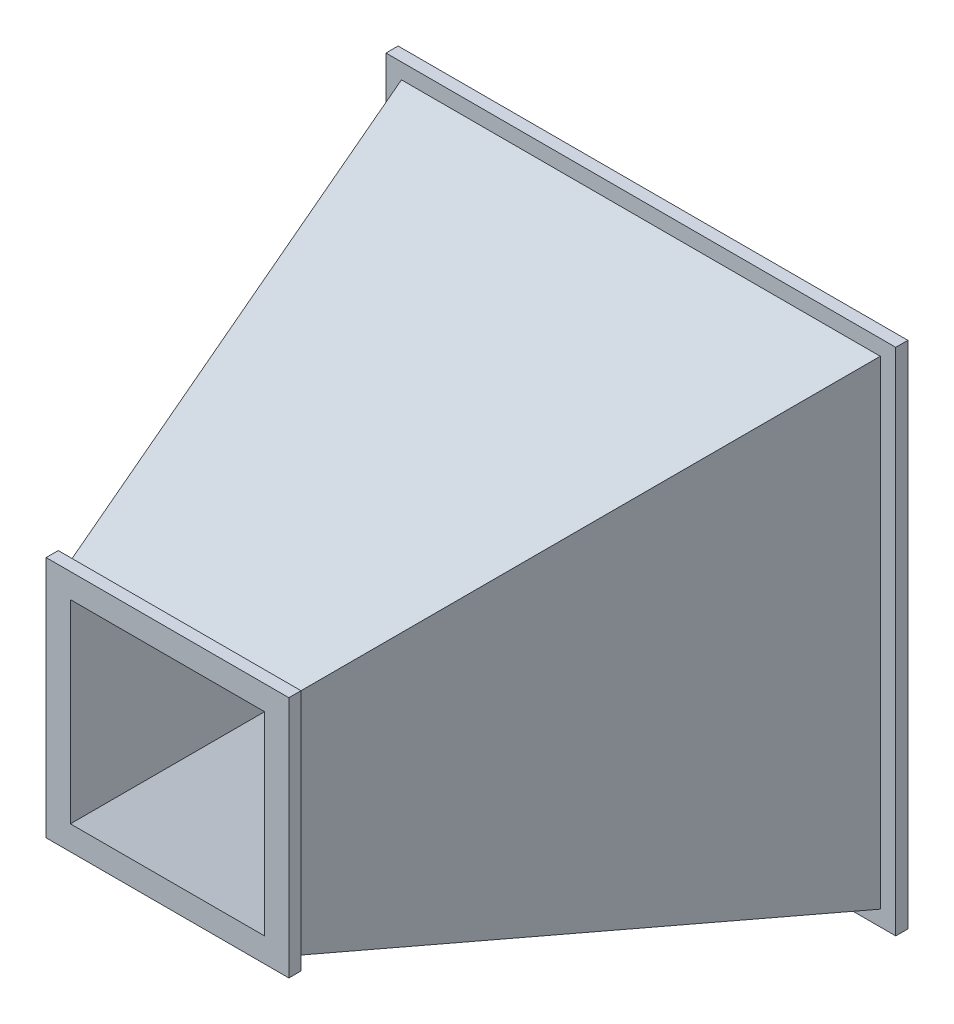
ISO-10303-21;
HEADER;
FILE_DESCRIPTION(('STEP AP214'),'2;1');
FILE_NAME('part.step','',(''),(''),'','','');
FILE_SCHEMA(('AUTOMOTIVE_DESIGN { 1 0 10303 214 1 1 1 1 }'));
ENDSEC;
DATA;
#1=APPLICATION_CONTEXT('core data for automotive mechanical design processes');
#2=APPLICATION_PROTOCOL_DEFINITION('international standard','automotive_design',2000,#1);
#3=PRODUCT_CONTEXT('',#1,'mechanical');
#4=PRODUCT('Part','Part','',(#3));
#5=PRODUCT_RELATED_PRODUCT_CATEGORY('part','',(#4));
#6=PRODUCT_DEFINITION_FORMATION('','',#4);
#7=PRODUCT_DEFINITION_CONTEXT('part definition',#1,'design');
#8=PRODUCT_DEFINITION('design','',#6,#7);
#9=PRODUCT_DEFINITION_SHAPE('','',#8);
#10=(LENGTH_UNIT() NAMED_UNIT(*) SI_UNIT(.MILLI.,.METRE.));
#11=(NAMED_UNIT(*) PLANE_ANGLE_UNIT() SI_UNIT($,.RADIAN.));
#12=(NAMED_UNIT(*) SI_UNIT($,.STERADIAN.) SOLID_ANGLE_UNIT());
#13=UNCERTAINTY_MEASURE_WITH_UNIT(LENGTH_MEASURE(1.E-05),#10,'distance_accuracy_value','');
#14=(GEOMETRIC_REPRESENTATION_CONTEXT(3) GLOBAL_UNCERTAINTY_ASSIGNED_CONTEXT((#13)) GLOBAL_UNIT_ASSIGNED_CONTEXT((#10,
#11,#12)) REPRESENTATION_CONTEXT('',''));
#15=CARTESIAN_POINT('',(0.,0.,0.));
#16=DIRECTION('',(0.,0.,1.));
#17=DIRECTION('',(1.,0.,0.));
#18=AXIS2_PLACEMENT_3D('',#15,#16,#17);
#19=CARTESIAN_POINT('',(0.,0.,0.));
#20=DIRECTION('',(0.,0.,1.));
#21=DIRECTION('',(1.,0.,0.));
#22=AXIS2_PLACEMENT_3D('',#19,#20,#21);
#23=PLANE('',#22);
#24=DIRECTION('',(1.,0.,0.));
#25=VECTOR('',#24,1.);
#26=CARTESIAN_POINT('',(-105.,105.,0.));
#27=LINE('',#26,#25);
#28=CARTESIAN_POINT('',(-105.,105.,0.));
#29=VERTEX_POINT('',#28);
#30=CARTESIAN_POINT('',(105.,105.,0.));
#31=VERTEX_POINT('',#30);
#32=EDGE_CURVE('E274',#29,#31,#27,.T.);
#33=ORIENTED_EDGE('',*,*,#32,.T.);
#34=DIRECTION('',(0.,-1.,0.));
#35=VECTOR('',#34,1.);
#36=CARTESIAN_POINT('',(105.,105.,0.));
#37=LINE('',#36,#35);
#38=CARTESIAN_POINT('',(105.,-105.,0.));
#39=VERTEX_POINT('',#38);
#40=EDGE_CURVE('E291',#31,#39,#37,.T.);
#41=ORIENTED_EDGE('',*,*,#40,.T.);
#42=DIRECTION('',(-1.,0.,0.));
#43=VECTOR('',#42,1.);
#44=CARTESIAN_POINT('',(105.,-105.,0.));
#45=LINE('',#44,#43);
#46=CARTESIAN_POINT('',(-105.,-105.,0.));
#47=VERTEX_POINT('',#46);
#48=EDGE_CURVE('E294',#39,#47,#45,.T.);
#49=ORIENTED_EDGE('',*,*,#48,.T.);
#50=DIRECTION('',(0.,1.,0.));
#51=VECTOR('',#50,1.);
#52=CARTESIAN_POINT('',(-105.,-105.,0.));
#53=LINE('',#52,#51);
#54=EDGE_CURVE('E279',#47,#29,#53,.T.);
#55=ORIENTED_EDGE('',*,*,#54,.T.);
#56=EDGE_LOOP('',(#33,#41,#49,#55));
#57=FACE_BOUND('',#56,.T.);
#58=DIRECTION('',(0.,-1.,0.));
#59=VECTOR('',#58,1.);
#60=CARTESIAN_POINT('',(95.,95.,0.));
#61=LINE('',#60,#59);
#62=CARTESIAN_POINT('',(95.,95.,0.));
#63=VERTEX_POINT('',#62);
#64=CARTESIAN_POINT('',(95.,-95.,0.));
#65=VERTEX_POINT('',#64);
#66=EDGE_CURVE('E208',#63,#65,#61,.T.);
#67=ORIENTED_EDGE('',*,*,#66,.F.);
#68=DIRECTION('',(1.,0.,0.));
#69=VECTOR('',#68,1.);
#70=CARTESIAN_POINT('',(-95.,95.,0.));
#71=LINE('',#70,#69);
#72=CARTESIAN_POINT('',(-95.,95.,0.));
#73=VERTEX_POINT('',#72);
#74=EDGE_CURVE('E211',#73,#63,#71,.T.);
#75=ORIENTED_EDGE('',*,*,#74,.F.);
#76=DIRECTION('',(0.,1.,0.));
#77=VECTOR('',#76,1.);
#78=CARTESIAN_POINT('',(-95.,-95.,0.));
#79=LINE('',#78,#77);
#80=CARTESIAN_POINT('',(-95.,-95.,0.));
#81=VERTEX_POINT('',#80);
#82=EDGE_CURVE('E202',#81,#73,#79,.T.);
#83=ORIENTED_EDGE('',*,*,#82,.F.);
#84=DIRECTION('',(-1.,0.,0.));
#85=VECTOR('',#84,1.);
#86=CARTESIAN_POINT('',(95.,-95.,0.));
#87=LINE('',#86,#85);
#88=EDGE_CURVE('E73',#65,#81,#87,.T.);
#89=ORIENTED_EDGE('',*,*,#88,.F.);
#90=EDGE_LOOP('',(#67,#75,#83,#89));
#91=FACE_BOUND('',#90,.T.);
#92=ADVANCED_FACE('F57',(#57,#91),#23,.F.);
#93=CARTESIAN_POINT('',(0.,0.,200.));
#94=DIRECTION('',(0.,0.,1.));
#95=DIRECTION('',(1.,0.,0.));
#96=AXIS2_PLACEMENT_3D('',#93,#94,#95);
#97=PLANE('',#96);
#98=DIRECTION('',(0.,1.,0.));
#99=VECTOR('',#98,1.);
#100=CARTESIAN_POINT('',(50.,-50.,200.));
#101=LINE('',#100,#99);
#102=CARTESIAN_POINT('',(50.,-50.,200.));
#103=VERTEX_POINT('',#102);
#104=CARTESIAN_POINT('',(50.,50.,200.));
#105=VERTEX_POINT('',#104);
#106=EDGE_CURVE('E204',#103,#105,#101,.T.);
#107=ORIENTED_EDGE('',*,*,#106,.T.);
#108=DIRECTION('',(-1.,0.,0.));
#109=VECTOR('',#108,1.);
#110=CARTESIAN_POINT('',(50.,50.,200.));
#111=LINE('',#110,#109);
#112=CARTESIAN_POINT('',(-50.,50.,200.));
#113=VERTEX_POINT('',#112);
#114=EDGE_CURVE('E250',#105,#113,#111,.T.);
#115=ORIENTED_EDGE('',*,*,#114,.T.);
#116=DIRECTION('',(0.,-1.,0.));
#117=VECTOR('',#116,1.);
#118=CARTESIAN_POINT('',(-50.,50.,200.));
#119=LINE('',#118,#117);
#120=CARTESIAN_POINT('',(-50.,-50.,200.));
#121=VERTEX_POINT('',#120);
#122=EDGE_CURVE('E253',#113,#121,#119,.T.);
#123=ORIENTED_EDGE('',*,*,#122,.T.);
#124=DIRECTION('',(1.,0.,0.));
#125=VECTOR('',#124,1.);
#126=CARTESIAN_POINT('',(-50.,-50.,200.));
#127=LINE('',#126,#125);
#128=EDGE_CURVE('E238',#121,#103,#127,.T.);
#129=ORIENTED_EDGE('',*,*,#128,.T.);
#130=EDGE_LOOP('',(#107,#115,#123,#129));
#131=FACE_BOUND('',#130,.T.);
#132=DIRECTION('',(-1.,0.,0.));
#133=VECTOR('',#132,1.);
#134=CARTESIAN_POINT('',(40.,40.,200.));
#135=LINE('',#134,#133);
#136=CARTESIAN_POINT('',(40.,40.,200.));
#137=VERTEX_POINT('',#136);
#138=CARTESIAN_POINT('',(-40.,40.,200.));
#139=VERTEX_POINT('',#138);
#140=EDGE_CURVE('E81',#137,#139,#135,.T.);
#141=ORIENTED_EDGE('',*,*,#140,.F.);
#142=DIRECTION('',(0.,1.,0.));
#143=VECTOR('',#142,1.);
#144=CARTESIAN_POINT('',(40.,-40.,200.));
#145=LINE('',#144,#143);
#146=CARTESIAN_POINT('',(40.,-40.,200.));
#147=VERTEX_POINT('',#146);
#148=EDGE_CURVE('E189',#147,#137,#145,.T.);
#149=ORIENTED_EDGE('',*,*,#148,.F.);
#150=DIRECTION('',(1.,0.,0.));
#151=VECTOR('',#150,1.);
#152=CARTESIAN_POINT('',(-40.,-40.,200.));
#153=LINE('',#152,#151);
#154=CARTESIAN_POINT('',(-40.,-40.,200.));
#155=VERTEX_POINT('',#154);
#156=EDGE_CURVE('E183',#155,#147,#153,.T.);
#157=ORIENTED_EDGE('',*,*,#156,.F.);
#158=DIRECTION('',(0.,-1.,0.));
#159=VECTOR('',#158,1.);
#160=CARTESIAN_POINT('',(-40.,40.,200.));
#161=LINE('',#160,#159);
#162=EDGE_CURVE('E172',#139,#155,#161,.T.);
#163=ORIENTED_EDGE('',*,*,#162,.F.);
#164=EDGE_LOOP('',(#141,#149,#157,#163));
#165=FACE_BOUND('',#164,.T.);
#166=ADVANCED_FACE('F187',(#131,#165),#97,.T.);
#167=CARTESIAN_POINT('',(0.,92.9692039511912,25.5665310865776));
#168=DIRECTION('',(0.,0.96420539280379,0.265156483021042));
#169=DIRECTION('',(0.,-0.265156483021042,0.96420539280379));
#170=AXIS2_PLACEMENT_3D('',#167,#168,#169);
#171=PLANE('',#170);
#172=DIRECTION('',(-0.256299566854098,0.256299566854098,-0.931998424923993));
#173=VECTOR('',#172,1.);
#174=CARTESIAN_POINT('',(-45.,45.,200.));
#175=LINE('',#174,#173);
#176=CARTESIAN_POINT('',(-46.375,46.375,195.));
#177=VERTEX_POINT('',#176);
#178=CARTESIAN_POINT('',(-98.625,98.625,4.99999999999999));
#179=VERTEX_POINT('',#178);
#180=EDGE_CURVE('E322',#177,#179,#175,.T.);
#181=ORIENTED_EDGE('',*,*,#180,.F.);
#182=DIRECTION('',(1.,0.,0.));
#183=VECTOR('',#182,1.);
#184=CARTESIAN_POINT('',(0.,46.375,195.));
#185=LINE('',#184,#183);
#186=CARTESIAN_POINT('',(46.375,46.375,195.));
#187=VERTEX_POINT('',#186);
#188=EDGE_CURVE('E271',#177,#187,#185,.T.);
#189=ORIENTED_EDGE('',*,*,#188,.T.);
#190=DIRECTION('',(0.256299566854098,0.256299566854098,-0.931998424923993));
#191=VECTOR('',#190,1.);
#192=CARTESIAN_POINT('',(45.,45.,200.));
#193=LINE('',#192,#191);
#194=CARTESIAN_POINT('',(98.625,98.625,4.99999999999999));
#195=VERTEX_POINT('',#194);
#196=EDGE_CURVE('E315',#187,#195,#193,.T.);
#197=ORIENTED_EDGE('',*,*,#196,.T.);
#198=DIRECTION('',(-1.,0.,0.));
#199=VECTOR('',#198,1.);
#200=CARTESIAN_POINT('',(0.,98.625,5.));
#201=LINE('',#200,#199);
#202=EDGE_CURVE('E312',#195,#179,#201,.T.);
#203=ORIENTED_EDGE('',*,*,#202,.T.);
#204=EDGE_LOOP('',(#181,#189,#197,#203));
#205=FACE_BOUND('',#204,.T.);
#206=ADVANCED_FACE('F349',(#205),#171,.T.);
#207=CARTESIAN_POINT('',(-92.9692039511911,0.,25.5665310865776));
#208=DIRECTION('',(-0.96420539280379,0.,0.265156483021042));
#209=DIRECTION('',(0.265156483021042,0.,0.96420539280379));
#210=AXIS2_PLACEMENT_3D('',#207,#208,#209);
#211=PLANE('',#210);
#212=DIRECTION('',(-0.256299566854098,-0.256299566854098,-0.931998424923993));
#213=VECTOR('',#212,1.);
#214=CARTESIAN_POINT('',(-45.,-45.,200.));
#215=LINE('',#214,#213);
#216=CARTESIAN_POINT('',(-46.375,-46.375,195.));
#217=VERTEX_POINT('',#216);
#218=CARTESIAN_POINT('',(-98.625,-98.625,5.));
#219=VERTEX_POINT('',#218);
#220=EDGE_CURVE('E328',#217,#219,#215,.T.);
#221=ORIENTED_EDGE('',*,*,#220,.F.);
#222=DIRECTION('',(0.,1.,0.));
#223=VECTOR('',#222,1.);
#224=CARTESIAN_POINT('',(-46.375,0.,195.));
#225=LINE('',#224,#223);
#226=EDGE_CURVE('E268',#217,#177,#225,.T.);
#227=ORIENTED_EDGE('',*,*,#226,.T.);
#228=ORIENTED_EDGE('',*,*,#180,.T.);
#229=DIRECTION('',(0.,-1.,0.));
#230=VECTOR('',#229,1.);
#231=CARTESIAN_POINT('',(-98.625,0.,5.));
#232=LINE('',#231,#230);
#233=EDGE_CURVE('E309',#179,#219,#232,.T.);
#234=ORIENTED_EDGE('',*,*,#233,.T.);
#235=EDGE_LOOP('',(#221,#227,#228,#234));
#236=FACE_BOUND('',#235,.T.);
#237=ADVANCED_FACE('F346',(#236),#211,.T.);
#238=CARTESIAN_POINT('',(92.9692039511912,0.,25.5665310865776));
#239=DIRECTION('',(0.96420539280379,0.,0.265156483021042));
#240=DIRECTION('',(0.265156483021042,0.,-0.96420539280379));
#241=AXIS2_PLACEMENT_3D('',#238,#239,#240);
#242=PLANE('',#241);
#243=ORIENTED_EDGE('',*,*,#196,.F.);
#244=DIRECTION('',(0.,-1.,0.));
#245=VECTOR('',#244,1.);
#246=CARTESIAN_POINT('',(46.375,0.,195.));
#247=LINE('',#246,#245);
#248=CARTESIAN_POINT('',(46.375,-46.375,195.));
#249=VERTEX_POINT('',#248);
#250=EDGE_CURVE('E260',#187,#249,#247,.T.);
#251=ORIENTED_EDGE('',*,*,#250,.T.);
#252=DIRECTION('',(0.256299566854098,-0.256299566854098,-0.931998424923993));
#253=VECTOR('',#252,1.);
#254=CARTESIAN_POINT('',(45.,-45.,200.));
#255=LINE('',#254,#253);
#256=CARTESIAN_POINT('',(98.625,-98.625,4.99999999999999));
#257=VERTEX_POINT('',#256);
#258=EDGE_CURVE('E324',#249,#257,#255,.T.);
#259=ORIENTED_EDGE('',*,*,#258,.T.);
#260=DIRECTION('',(0.,1.,0.));
#261=VECTOR('',#260,1.);
#262=CARTESIAN_POINT('',(98.625,0.,5.));
#263=LINE('',#262,#261);
#264=EDGE_CURVE('E301',#257,#195,#263,.T.);
#265=ORIENTED_EDGE('',*,*,#264,.T.);
#266=EDGE_LOOP('',(#243,#251,#259,#265));
#267=FACE_BOUND('',#266,.T.);
#268=ADVANCED_FACE('F351',(#267),#242,.T.);
#269=CARTESIAN_POINT('',(0.,-92.9692039511912,25.5665310865776));
#270=DIRECTION('',(0.,-0.96420539280379,0.265156483021042));
#271=DIRECTION('',(0.,-0.265156483021042,-0.96420539280379));
#272=AXIS2_PLACEMENT_3D('',#269,#270,#271);
#273=PLANE('',#272);
#274=ORIENTED_EDGE('',*,*,#258,.F.);
#275=DIRECTION('',(-1.,0.,0.));
#276=VECTOR('',#275,1.);
#277=CARTESIAN_POINT('',(0.,-46.375,195.));
#278=LINE('',#277,#276);
#279=EDGE_CURVE('E12',#249,#217,#278,.T.);
#280=ORIENTED_EDGE('',*,*,#279,.T.);
#281=ORIENTED_EDGE('',*,*,#220,.T.);
#282=DIRECTION('',(1.,0.,0.));
#283=VECTOR('',#282,1.);
#284=CARTESIAN_POINT('',(0.,-98.625,5.));
#285=LINE('',#284,#283);
#286=EDGE_CURVE('E65',#219,#257,#285,.T.);
#287=ORIENTED_EDGE('',*,*,#286,.T.);
#288=EDGE_LOOP('',(#274,#280,#281,#287));
#289=FACE_BOUND('',#288,.T.);
#290=ADVANCED_FACE('F340',(#289),#273,.T.);
#291=CARTESIAN_POINT('',(-105.,105.,5.));
#292=DIRECTION('',(0.,1.,0.));
#293=DIRECTION('',(0.,0.,1.));
#294=AXIS2_PLACEMENT_3D('',#291,#292,#293);
#295=PLANE('',#294);
#296=ORIENTED_EDGE('',*,*,#32,.F.);
#297=DIRECTION('',(0.,0.,-1.));
#298=VECTOR('',#297,1.);
#299=CARTESIAN_POINT('',(-105.,105.,5.));
#300=LINE('',#299,#298);
#301=CARTESIAN_POINT('',(-105.,105.,5.));
#302=VERTEX_POINT('',#301);
#303=EDGE_CURVE('E299',#302,#29,#300,.T.);
#304=ORIENTED_EDGE('',*,*,#303,.F.);
#305=DIRECTION('',(1.,0.,0.));
#306=VECTOR('',#305,1.);
#307=CARTESIAN_POINT('',(-105.,105.,5.));
#308=LINE('',#307,#306);
#309=CARTESIAN_POINT('',(105.,105.,5.));
#310=VERTEX_POINT('',#309);
#311=EDGE_CURVE('E275',#302,#310,#308,.T.);
#312=ORIENTED_EDGE('',*,*,#311,.T.);
#313=DIRECTION('',(0.,0.,-1.));
#314=VECTOR('',#313,1.);
#315=CARTESIAN_POINT('',(105.,105.,5.));
#316=LINE('',#315,#314);
#317=EDGE_CURVE('E288',#310,#31,#316,.T.);
#318=ORIENTED_EDGE('',*,*,#317,.T.);
#319=EDGE_LOOP('',(#296,#304,#312,#318));
#320=FACE_BOUND('',#319,.T.);
#321=ADVANCED_FACE('F383',(#320),#295,.T.);
#322=CARTESIAN_POINT('',(-105.,-105.,5.));
#323=DIRECTION('',(-1.,0.,0.));
#324=DIRECTION('',(0.,-1.,0.));
#325=AXIS2_PLACEMENT_3D('',#322,#323,#324);
#326=PLANE('',#325);
#327=ORIENTED_EDGE('',*,*,#54,.F.);
#328=DIRECTION('',(0.,0.,-1.));
#329=VECTOR('',#328,1.);
#330=CARTESIAN_POINT('',(-105.,-105.,5.));
#331=LINE('',#330,#329);
#332=CARTESIAN_POINT('',(-105.,-105.,5.));
#333=VERTEX_POINT('',#332);
#334=EDGE_CURVE('E302',#333,#47,#331,.T.);
#335=ORIENTED_EDGE('',*,*,#334,.F.);
#336=DIRECTION('',(0.,1.,0.));
#337=VECTOR('',#336,1.);
#338=CARTESIAN_POINT('',(-105.,-105.,5.));
#339=LINE('',#338,#337);
#340=EDGE_CURVE('E285',#333,#302,#339,.T.);
#341=ORIENTED_EDGE('',*,*,#340,.T.);
#342=ORIENTED_EDGE('',*,*,#303,.T.);
#343=EDGE_LOOP('',(#327,#335,#341,#342));
#344=FACE_BOUND('',#343,.T.);
#345=ADVANCED_FACE('F394',(#344),#326,.T.);
#346=CARTESIAN_POINT('',(105.,-105.,5.));
#347=DIRECTION('',(0.,-1.,0.));
#348=DIRECTION('',(0.,0.,-1.));
#349=AXIS2_PLACEMENT_3D('',#346,#347,#348);
#350=PLANE('',#349);
#351=ORIENTED_EDGE('',*,*,#48,.F.);
#352=DIRECTION('',(0.,0.,-1.));
#353=VECTOR('',#352,1.);
#354=CARTESIAN_POINT('',(105.,-105.,5.));
#355=LINE('',#354,#353);
#356=CARTESIAN_POINT('',(105.,-105.,5.));
#357=VERTEX_POINT('',#356);
#358=EDGE_CURVE('E304',#357,#39,#355,.T.);
#359=ORIENTED_EDGE('',*,*,#358,.F.);
#360=DIRECTION('',(-1.,0.,0.));
#361=VECTOR('',#360,1.);
#362=CARTESIAN_POINT('',(105.,-105.,5.));
#363=LINE('',#362,#361);
#364=EDGE_CURVE('E282',#357,#333,#363,.T.);
#365=ORIENTED_EDGE('',*,*,#364,.T.);
#366=ORIENTED_EDGE('',*,*,#334,.T.);
#367=EDGE_LOOP('',(#351,#359,#365,#366));
#368=FACE_BOUND('',#367,.T.);
#369=ADVANCED_FACE('F399',(#368),#350,.T.);
#370=CARTESIAN_POINT('',(105.,105.,5.));
#371=DIRECTION('',(1.,0.,0.));
#372=DIRECTION('',(0.,1.,0.));
#373=AXIS2_PLACEMENT_3D('',#370,#371,#372);
#374=PLANE('',#373);
#375=ORIENTED_EDGE('',*,*,#40,.F.);
#376=ORIENTED_EDGE('',*,*,#317,.F.);
#377=DIRECTION('',(0.,-1.,0.));
#378=VECTOR('',#377,1.);
#379=CARTESIAN_POINT('',(105.,105.,5.));
#380=LINE('',#379,#378);
#381=EDGE_CURVE('E278',#310,#357,#380,.T.);
#382=ORIENTED_EDGE('',*,*,#381,.T.);
#383=ORIENTED_EDGE('',*,*,#358,.T.);
#384=EDGE_LOOP('',(#375,#376,#382,#383));
#385=FACE_BOUND('',#384,.T.);
#386=ADVANCED_FACE('F411',(#385),#374,.T.);
#387=CARTESIAN_POINT('',(0.,0.,5.));
#388=DIRECTION('',(0.,0.,-1.));
#389=DIRECTION('',(-1.,0.,0.));
#390=AXIS2_PLACEMENT_3D('',#387,#388,#389);
#391=PLANE('',#390);
#392=ORIENTED_EDGE('',*,*,#202,.F.);
#393=ORIENTED_EDGE('',*,*,#264,.F.);
#394=ORIENTED_EDGE('',*,*,#286,.F.);
#395=ORIENTED_EDGE('',*,*,#233,.F.);
#396=EDGE_LOOP('',(#392,#393,#394,#395));
#397=FACE_BOUND('',#396,.T.);
#398=ORIENTED_EDGE('',*,*,#311,.F.);
#399=ORIENTED_EDGE('',*,*,#340,.F.);
#400=ORIENTED_EDGE('',*,*,#364,.F.);
#401=ORIENTED_EDGE('',*,*,#381,.F.);
#402=EDGE_LOOP('',(#398,#399,#400,#401));
#403=FACE_BOUND('',#402,.T.);
#404=ADVANCED_FACE('F344',(#397,#403),#391,.F.);
#405=CARTESIAN_POINT('',(50.,-50.,195.));
#406=DIRECTION('',(1.,0.,0.));
#407=DIRECTION('',(0.,1.,0.));
#408=AXIS2_PLACEMENT_3D('',#405,#406,#407);
#409=PLANE('',#408);
#410=ORIENTED_EDGE('',*,*,#106,.F.);
#411=DIRECTION('',(0.,0.,1.));
#412=VECTOR('',#411,1.);
#413=CARTESIAN_POINT('',(50.,-50.,195.));
#414=LINE('',#413,#412);
#415=CARTESIAN_POINT('',(50.,-50.,195.));
#416=VERTEX_POINT('',#415);
#417=EDGE_CURVE('E258',#416,#103,#414,.T.);
#418=ORIENTED_EDGE('',*,*,#417,.F.);
#419=DIRECTION('',(0.,1.,0.));
#420=VECTOR('',#419,1.);
#421=CARTESIAN_POINT('',(50.,-50.,195.));
#422=LINE('',#421,#420);
#423=CARTESIAN_POINT('',(50.,50.,195.));
#424=VERTEX_POINT('',#423);
#425=EDGE_CURVE('E234',#416,#424,#422,.T.);
#426=ORIENTED_EDGE('',*,*,#425,.T.);
#427=DIRECTION('',(0.,0.,1.));
#428=VECTOR('',#427,1.);
#429=CARTESIAN_POINT('',(50.,50.,195.));
#430=LINE('',#429,#428);
#431=EDGE_CURVE('E247',#424,#105,#430,.T.);
#432=ORIENTED_EDGE('',*,*,#431,.T.);
#433=EDGE_LOOP('',(#410,#418,#426,#432));
#434=FACE_BOUND('',#433,.T.);
#435=ADVANCED_FACE('F371',(#434),#409,.T.);
#436=CARTESIAN_POINT('',(-50.,-50.,195.));
#437=DIRECTION('',(0.,-1.,0.));
#438=DIRECTION('',(0.,0.,-1.));
#439=AXIS2_PLACEMENT_3D('',#436,#437,#438);
#440=PLANE('',#439);
#441=ORIENTED_EDGE('',*,*,#128,.F.);
#442=DIRECTION('',(0.,0.,1.));
#443=VECTOR('',#442,1.);
#444=CARTESIAN_POINT('',(-50.,-50.,195.));
#445=LINE('',#444,#443);
#446=CARTESIAN_POINT('',(-50.,-50.,195.));
#447=VERTEX_POINT('',#446);
#448=EDGE_CURVE('E261',#447,#121,#445,.T.);
#449=ORIENTED_EDGE('',*,*,#448,.F.);
#450=DIRECTION('',(1.,0.,0.));
#451=VECTOR('',#450,1.);
#452=CARTESIAN_POINT('',(-50.,-50.,195.));
#453=LINE('',#452,#451);
#454=EDGE_CURVE('E244',#447,#416,#453,.T.);
#455=ORIENTED_EDGE('',*,*,#454,.T.);
#456=ORIENTED_EDGE('',*,*,#417,.T.);
#457=EDGE_LOOP('',(#441,#449,#455,#456));
#458=FACE_BOUND('',#457,.T.);
#459=ADVANCED_FACE('F364',(#458),#440,.T.);
#460=CARTESIAN_POINT('',(-50.,50.,195.));
#461=DIRECTION('',(-1.,0.,0.));
#462=DIRECTION('',(0.,-1.,0.));
#463=AXIS2_PLACEMENT_3D('',#460,#461,#462);
#464=PLANE('',#463);
#465=ORIENTED_EDGE('',*,*,#122,.F.);
#466=DIRECTION('',(0.,0.,1.));
#467=VECTOR('',#466,1.);
#468=CARTESIAN_POINT('',(-50.,50.,195.));
#469=LINE('',#468,#467);
#470=CARTESIAN_POINT('',(-50.,50.,195.));
#471=VERTEX_POINT('',#470);
#472=EDGE_CURVE('E263',#471,#113,#469,.T.);
#473=ORIENTED_EDGE('',*,*,#472,.F.);
#474=DIRECTION('',(0.,-1.,0.));
#475=VECTOR('',#474,1.);
#476=CARTESIAN_POINT('',(-50.,50.,195.));
#477=LINE('',#476,#475);
#478=EDGE_CURVE('E241',#471,#447,#477,.T.);
#479=ORIENTED_EDGE('',*,*,#478,.T.);
#480=ORIENTED_EDGE('',*,*,#448,.T.);
#481=EDGE_LOOP('',(#465,#473,#479,#480));
#482=FACE_BOUND('',#481,.T.);
#483=ADVANCED_FACE('F368',(#482),#464,.T.);
#484=CARTESIAN_POINT('',(50.,50.,195.));
#485=DIRECTION('',(0.,1.,0.));
#486=DIRECTION('',(0.,0.,1.));
#487=AXIS2_PLACEMENT_3D('',#484,#485,#486);
#488=PLANE('',#487);
#489=ORIENTED_EDGE('',*,*,#114,.F.);
#490=ORIENTED_EDGE('',*,*,#431,.F.);
#491=DIRECTION('',(-1.,0.,0.));
#492=VECTOR('',#491,1.);
#493=CARTESIAN_POINT('',(50.,50.,195.));
#494=LINE('',#493,#492);
#495=EDGE_CURVE('E237',#424,#471,#494,.T.);
#496=ORIENTED_EDGE('',*,*,#495,.T.);
#497=ORIENTED_EDGE('',*,*,#472,.T.);
#498=EDGE_LOOP('',(#489,#490,#496,#497));
#499=FACE_BOUND('',#498,.T.);
#500=ADVANCED_FACE('F355',(#499),#488,.T.);
#501=CARTESIAN_POINT('',(0.,0.,195.));
#502=DIRECTION('',(0.,0.,1.));
#503=DIRECTION('',(1.,0.,0.));
#504=AXIS2_PLACEMENT_3D('',#501,#502,#503);
#505=PLANE('',#504);
#506=ORIENTED_EDGE('',*,*,#188,.F.);
#507=ORIENTED_EDGE('',*,*,#226,.F.);
#508=ORIENTED_EDGE('',*,*,#279,.F.);
#509=ORIENTED_EDGE('',*,*,#250,.F.);
#510=EDGE_LOOP('',(#506,#507,#508,#509));
#511=FACE_BOUND('',#510,.T.);
#512=ORIENTED_EDGE('',*,*,#425,.F.);
#513=ORIENTED_EDGE('',*,*,#454,.F.);
#514=ORIENTED_EDGE('',*,*,#478,.F.);
#515=ORIENTED_EDGE('',*,*,#495,.F.);
#516=EDGE_LOOP('',(#512,#513,#514,#515));
#517=FACE_BOUND('',#516,.T.);
#518=ADVANCED_FACE('F352',(#511,#517),#505,.F.);
#519=CARTESIAN_POINT('',(88.3207437536316,0.,24.2882045322487));
#520=DIRECTION('',(-0.96420539280379,0.,-0.265156483021042));
#521=DIRECTION('',(-0.265156483021042,0.,0.96420539280379));
#522=AXIS2_PLACEMENT_3D('',#519,#520,#521);
#523=PLANE('',#522);
#524=DIRECTION('',(0.256299566854098,-0.256299566854098,-0.931998424923993));
#525=VECTOR('',#524,1.);
#526=CARTESIAN_POINT('',(40.,-40.,200.));
#527=LINE('',#526,#525);
#528=EDGE_CURVE('E179',#147,#65,#527,.T.);
#529=ORIENTED_EDGE('',*,*,#528,.F.);
#530=ORIENTED_EDGE('',*,*,#148,.T.);
#531=DIRECTION('',(0.256299566854098,0.256299566854098,-0.931998424923993));
#532=VECTOR('',#531,1.);
#533=CARTESIAN_POINT('',(40.,40.,200.));
#534=LINE('',#533,#532);
#535=EDGE_CURVE('E185',#137,#63,#534,.T.);
#536=ORIENTED_EDGE('',*,*,#535,.T.);
#537=ORIENTED_EDGE('',*,*,#66,.T.);
#538=EDGE_LOOP('',(#529,#530,#536,#537));
#539=FACE_BOUND('',#538,.T.);
#540=ADVANCED_FACE('F218',(#539),#523,.T.);
#541=CARTESIAN_POINT('',(0.,88.3207437536316,24.2882045322487));
#542=DIRECTION('',(0.,-0.96420539280379,-0.265156483021042));
#543=DIRECTION('',(0.,0.265156483021042,-0.96420539280379));
#544=AXIS2_PLACEMENT_3D('',#541,#542,#543);
#545=PLANE('',#544);
#546=ORIENTED_EDGE('',*,*,#535,.F.);
#547=ORIENTED_EDGE('',*,*,#140,.T.);
#548=DIRECTION('',(-0.256299566854098,0.256299566854098,-0.931998424923993));
#549=VECTOR('',#548,1.);
#550=CARTESIAN_POINT('',(-40.,40.,200.));
#551=LINE('',#550,#549);
#552=EDGE_CURVE('E176',#139,#73,#551,.T.);
#553=ORIENTED_EDGE('',*,*,#552,.T.);
#554=ORIENTED_EDGE('',*,*,#74,.T.);
#555=EDGE_LOOP('',(#546,#547,#553,#554));
#556=FACE_BOUND('',#555,.T.);
#557=ADVANCED_FACE('F221',(#556),#545,.T.);
#558=CARTESIAN_POINT('',(0.,-88.3207437536316,24.2882045322487));
#559=DIRECTION('',(0.,0.96420539280379,-0.265156483021042));
#560=DIRECTION('',(0.,0.265156483021042,0.96420539280379));
#561=AXIS2_PLACEMENT_3D('',#558,#559,#560);
#562=PLANE('',#561);
#563=DIRECTION('',(-0.256299566854098,-0.256299566854098,-0.931998424923993));
#564=VECTOR('',#563,1.);
#565=CARTESIAN_POINT('',(-40.,-40.,200.));
#566=LINE('',#565,#564);
#567=EDGE_CURVE('E174',#155,#81,#566,.T.);
#568=ORIENTED_EDGE('',*,*,#567,.F.);
#569=ORIENTED_EDGE('',*,*,#156,.T.);
#570=ORIENTED_EDGE('',*,*,#528,.T.);
#571=ORIENTED_EDGE('',*,*,#88,.T.);
#572=EDGE_LOOP('',(#568,#569,#570,#571));
#573=FACE_BOUND('',#572,.T.);
#574=ADVANCED_FACE('F182',(#573),#562,.T.);
#575=CARTESIAN_POINT('',(-88.3207437536316,0.,24.2882045322487));
#576=DIRECTION('',(0.964205392803791,0.,-0.265156483021042));
#577=DIRECTION('',(-0.265156483021042,0.,-0.96420539280379));
#578=AXIS2_PLACEMENT_3D('',#575,#576,#577);
#579=PLANE('',#578);
#580=ORIENTED_EDGE('',*,*,#552,.F.);
#581=ORIENTED_EDGE('',*,*,#162,.T.);
#582=ORIENTED_EDGE('',*,*,#567,.T.);
#583=ORIENTED_EDGE('',*,*,#82,.T.);
#584=EDGE_LOOP('',(#580,#581,#582,#583));
#585=FACE_BOUND('',#584,.T.);
#586=ADVANCED_FACE('F173',(#585),#579,.T.);
#587=CLOSED_SHELL('',(#92,#166,#206,#237,#268,#290,#321,#345,#369,#386,#404,#435,#459,#483,#500,
#518,#540,#557,#574,#586));
#588=MANIFOLD_SOLID_BREP('B2',#587);
#589=ADVANCED_BREP_SHAPE_REPRESENTATION('',(#18,#588),#14);
#590=SHAPE_DEFINITION_REPRESENTATION(#9,#589);
ENDSEC;
END-ISO-10303-21;
